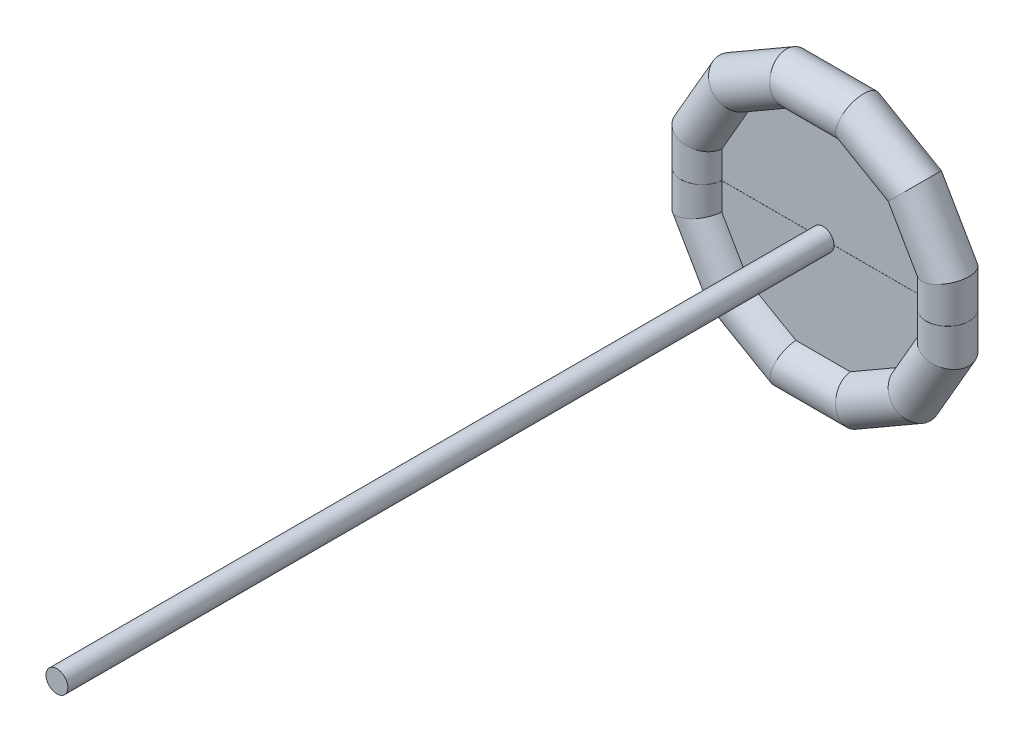
ISO-10303-21;
HEADER;
FILE_DESCRIPTION(('STEP AP214'),'2;1');
FILE_NAME('part.step','',(''),(''),'','','');
FILE_SCHEMA(('AUTOMOTIVE_DESIGN { 1 0 10303 214 1 1 1 1 }'));
ENDSEC;
DATA;
#1=APPLICATION_CONTEXT('core data for automotive mechanical design processes');
#2=APPLICATION_PROTOCOL_DEFINITION('international standard','automotive_design',2000,#1);
#3=PRODUCT_CONTEXT('',#1,'mechanical');
#4=PRODUCT('Part','Part','',(#3));
#5=PRODUCT_RELATED_PRODUCT_CATEGORY('part','',(#4));
#6=PRODUCT_DEFINITION_FORMATION('','',#4);
#7=PRODUCT_DEFINITION_CONTEXT('part definition',#1,'design');
#8=PRODUCT_DEFINITION('design','',#6,#7);
#9=PRODUCT_DEFINITION_SHAPE('','',#8);
#10=(LENGTH_UNIT() NAMED_UNIT(*) SI_UNIT(.MILLI.,.METRE.));
#11=(NAMED_UNIT(*) PLANE_ANGLE_UNIT() SI_UNIT($,.RADIAN.));
#12=(NAMED_UNIT(*) SI_UNIT($,.STERADIAN.) SOLID_ANGLE_UNIT());
#13=UNCERTAINTY_MEASURE_WITH_UNIT(LENGTH_MEASURE(1.E-05),#10,'distance_accuracy_value','');
#14=(GEOMETRIC_REPRESENTATION_CONTEXT(3) GLOBAL_UNCERTAINTY_ASSIGNED_CONTEXT((#13)) GLOBAL_UNIT_ASSIGNED_CONTEXT((#10,
#11,#12)) REPRESENTATION_CONTEXT('',''));
#15=CARTESIAN_POINT('',(0.,0.,0.));
#16=DIRECTION('',(0.,0.,1.));
#17=DIRECTION('',(1.,0.,0.));
#18=AXIS2_PLACEMENT_3D('',#15,#16,#17);
#19=CARTESIAN_POINT('',(0.,0.,-10079.1542714033));
#20=DIRECTION('',(0.,0.,1.));
#21=DIRECTION('',(1.,0.,0.));
#22=AXIS2_PLACEMENT_3D('',#19,#20,#21);
#23=PLANE('',#22);
#24=DIRECTION('',(1.,0.,0.));
#25=VECTOR('',#24,1.);
#26=CARTESIAN_POINT('',(5016.94381271313,-5.08455526785216,-10079.1542714033));
#27=LINE('',#26,#25);
#28=CARTESIAN_POINT('',(-533.375765570319,-5.08455526792967,-10079.1542714033));
#29=VERTEX_POINT('',#28);
#30=CARTESIAN_POINT('',(533.375765570319,-5.08455526830635,-10079.1542714033));
#31=VERTEX_POINT('',#30);
#32=EDGE_CURVE('E56',#29,#31,#27,.T.);
#33=ORIENTED_EDGE('',*,*,#32,.F.);
#34=CARTESIAN_POINT('',(0.,0.,-10079.1542714033));
#35=DIRECTION('',(0.,0.,1.));
#36=DIRECTION('',(1.,0.,0.));
#37=AXIS2_PLACEMENT_3D('',#34,#35,#36);
#38=CIRCLE('',#37,533.4);
#39=CARTESIAN_POINT('',(-533.4,-0.00455526792932917,-10079.1542714033));
#40=VERTEX_POINT('',#39);
#41=EDGE_CURVE('E248',#40,#29,#38,.T.);
#42=ORIENTED_EDGE('',*,*,#41,.F.);
#43=DIRECTION('',(1.,0.,0.));
#44=VECTOR('',#43,1.);
#45=CARTESIAN_POINT('',(5016.94381271313,-0.00455526785181348,-10079.1542714033));
#46=LINE('',#45,#44);
#47=CARTESIAN_POINT('',(533.399999980549,-0.00455526791460199,-10079.1542714033));
#48=VERTEX_POINT('',#47);
#49=EDGE_CURVE('E64',#40,#48,#46,.T.);
#50=ORIENTED_EDGE('',*,*,#49,.T.);
#51=EDGE_CURVE('E252',#31,#48,#38,.T.);
#52=ORIENTED_EDGE('',*,*,#51,.F.);
#53=EDGE_LOOP('',(#33,#42,#50,#52));
#54=FACE_BOUND('',#53,.T.);
#55=ADVANCED_FACE('F41',(#54),#23,.F.);
#56=CARTESIAN_POINT('',(5016.94381271306,5016.9577247322,-10079.1542714032));
#57=DIRECTION('',(0.,0.,-1.));
#58=DIRECTION('',(0.,-1.,0.));
#59=AXIS2_PLACEMENT_3D('',#56,#57,#58);
#60=PLANE('',#59);
#61=EDGE_CURVE('E177',#48,#40,#38,.T.);
#62=ORIENTED_EDGE('',*,*,#61,.F.);
#63=CARTESIAN_POINT('',(4945.52443736012,-0.00455526785270166,-10079.1542714033));
#64=VERTEX_POINT('',#63);
#65=EDGE_CURVE('E254',#48,#64,#46,.T.);
#66=ORIENTED_EDGE('',*,*,#65,.T.);
#67=DIRECTION('',(0.,1.,0.));
#68=VECTOR('',#67,1.);
#69=CARTESIAN_POINT('',(4945.52443736134,-70408.8045552679,-10079.154271404));
#70=LINE('',#69,#68);
#71=CARTESIAN_POINT('',(4945.52443736009,1325.14967216577,-10079.1542714033));
#72=VERTEX_POINT('',#71);
#73=EDGE_CURVE('E49',#72,#64,#70,.F.);
#74=ORIENTED_EDGE('',*,*,#73,.F.);
#75=DIRECTION('',(-0.500000000000016,0.866025403784429,0.));
#76=VECTOR('',#75,1.);
#77=CARTESIAN_POINT('',(39487.3473236444,-58503.0425529215,-10079.1542714041));
#78=LINE('',#77,#76);
#79=CARTESIAN_POINT('',(3620.37020992644,3620.38412194544,-10079.1542714032));
#80=VERTEX_POINT('',#79);
#81=EDGE_CURVE('E302',#80,#72,#78,.F.);
#82=ORIENTED_EDGE('',*,*,#81,.F.);
#83=DIRECTION('',(-0.866025403784449,0.499999999999983,0.));
#84=VECTOR('',#83,1.);
#85=CARTESIAN_POINT('',(63448.5624350151,-30921.4387643366,-10079.154271404));
#86=LINE('',#85,#84);
#87=CARTESIAN_POINT('',(1325.13576014672,4945.538349379,-10079.1542714032));
#88=VERTEX_POINT('',#87);
#89=EDGE_CURVE('E294',#88,#80,#86,.F.);
#90=ORIENTED_EDGE('',*,*,#89,.F.);
#91=DIRECTION('',(-1.,0.,0.));
#92=VECTOR('',#91,1.);
#93=CARTESIAN_POINT('',(70408.7815327131,4945.53834938045,-10079.1542714037));
#94=LINE('',#93,#92);
#95=CARTESIAN_POINT('',(-1325.1726947205,4945.53834937895,-10079.1542714032));
#96=VERTEX_POINT('',#95);
#97=EDGE_CURVE('E286',#96,#88,#94,.F.);
#98=ORIENTED_EDGE('',*,*,#97,.F.);
#99=DIRECTION('',(-0.866025403784428,-0.500000000000019,0.));
#100=VECTOR('',#99,1.);
#101=CARTESIAN_POINT('',(58503.0195303667,39487.3612356635,-10079.1542714033));
#102=LINE('',#101,#100);
#103=CARTESIAN_POINT('',(-3620.40714450016,3620.38412194529,-10079.1542714032));
#104=VERTEX_POINT('',#103);
#105=EDGE_CURVE('E278',#104,#96,#102,.F.);
#106=ORIENTED_EDGE('',*,*,#105,.F.);
#107=DIRECTION('',(-0.49999999999998,-0.86602540378445,0.));
#108=VECTOR('',#107,1.);
#109=CARTESIAN_POINT('',(30921.4157417817,63448.576347034,-10079.1542714028));
#110=LINE('',#109,#108);
#111=CARTESIAN_POINT('',(-4945.56137193372,1325.14967216556,-10079.1542714032));
#112=VERTEX_POINT('',#111);
#113=EDGE_CURVE('E270',#112,#104,#110,.F.);
#114=ORIENTED_EDGE('',*,*,#113,.F.);
#115=DIRECTION('',(0.,-1.,0.));
#116=VECTOR('',#115,1.);
#117=CARTESIAN_POINT('',(-4945.5613719354,70408.795444732,-10079.1542714025));
#118=LINE('',#117,#116);
#119=CARTESIAN_POINT('',(-4945.56137193368,-0.00455526799125749,-10079.1542714032));
#120=VERTEX_POINT('',#119);
#121=EDGE_CURVE('E262',#120,#112,#118,.F.);
#122=ORIENTED_EDGE('',*,*,#121,.F.);
#123=EDGE_CURVE('E255',#120,#40,#46,.T.);
#124=ORIENTED_EDGE('',*,*,#123,.T.);
#125=EDGE_LOOP('',(#62,#66,#74,#82,#90,#98,#106,#114,#122,#124));
#126=FACE_BOUND('',#125,.T.);
#127=ADVANCED_FACE('F43',(#126),#60,.F.);
#128=CARTESIAN_POINT('',(5016.94381271306,5016.9577247322,-10262.5105214032));
#129=DIRECTION('',(0.,0.,-1.));
#130=DIRECTION('',(0.,-1.,0.));
#131=AXIS2_PLACEMENT_3D('',#128,#129,#130);
#132=PLANE('',#131);
#133=DIRECTION('',(1.,0.,0.));
#134=VECTOR('',#133,1.);
#135=CARTESIAN_POINT('',(5016.94381271313,-0.00455526785003713,-10262.5105214033));
#136=LINE('',#135,#134);
#137=CARTESIAN_POINT('',(-4945.56137193368,-0.00455526798859296,-10262.5105214032));
#138=VERTEX_POINT('',#137);
#139=CARTESIAN_POINT('',(4945.52443736012,-0.0045552678509253,-10262.5105214033));
#140=VERTEX_POINT('',#139);
#141=EDGE_CURVE('E247',#138,#140,#136,.T.);
#142=ORIENTED_EDGE('',*,*,#141,.F.);
#143=DIRECTION('',(0.,-1.,0.));
#144=VECTOR('',#143,1.);
#145=CARTESIAN_POINT('',(-4945.5613719354,70408.795444732,-10262.5105214025));
#146=LINE('',#145,#144);
#147=CARTESIAN_POINT('',(-4945.56137193371,1325.14967216557,-10262.5105214032));
#148=VERTEX_POINT('',#147);
#149=EDGE_CURVE('E260',#138,#148,#146,.F.);
#150=ORIENTED_EDGE('',*,*,#149,.T.);
#151=DIRECTION('',(-0.49999999999998,-0.86602540378445,0.));
#152=VECTOR('',#151,1.);
#153=CARTESIAN_POINT('',(30921.4157417817,63448.576347034,-10262.5105214028));
#154=LINE('',#153,#152);
#155=CARTESIAN_POINT('',(-3620.40714450016,3620.38412194529,-10262.5105214032));
#156=VERTEX_POINT('',#155);
#157=EDGE_CURVE('E267',#148,#156,#154,.F.);
#158=ORIENTED_EDGE('',*,*,#157,.T.);
#159=DIRECTION('',(-0.866025403784428,-0.500000000000019,0.));
#160=VECTOR('',#159,1.);
#161=CARTESIAN_POINT('',(58503.0195303667,39487.3612356635,-10262.5105214033));
#162=LINE('',#161,#160);
#163=CARTESIAN_POINT('',(-1325.17269472049,4945.53834937895,-10262.5105214032));
#164=VERTEX_POINT('',#163);
#165=EDGE_CURVE('E275',#156,#164,#162,.F.);
#166=ORIENTED_EDGE('',*,*,#165,.T.);
#167=DIRECTION('',(-1.,0.,0.));
#168=VECTOR('',#167,1.);
#169=CARTESIAN_POINT('',(70408.7815327131,4945.53834938045,-10262.5105214037));
#170=LINE('',#169,#168);
#171=CARTESIAN_POINT('',(1325.13576014672,4945.538349379,-10262.5105214032));
#172=VERTEX_POINT('',#171);
#173=EDGE_CURVE('E283',#164,#172,#170,.F.);
#174=ORIENTED_EDGE('',*,*,#173,.T.);
#175=DIRECTION('',(-0.866025403784449,0.499999999999983,0.));
#176=VECTOR('',#175,1.);
#177=CARTESIAN_POINT('',(63448.5624350151,-30921.4387643366,-10262.510521404));
#178=LINE('',#177,#176);
#179=CARTESIAN_POINT('',(3620.37020992644,3620.38412194544,-10262.5105214032));
#180=VERTEX_POINT('',#179);
#181=EDGE_CURVE('E291',#172,#180,#178,.F.);
#182=ORIENTED_EDGE('',*,*,#181,.T.);
#183=DIRECTION('',(-0.500000000000016,0.866025403784429,0.));
#184=VECTOR('',#183,1.);
#185=CARTESIAN_POINT('',(39487.3473236444,-58503.0425529215,-10262.5105214042));
#186=LINE('',#185,#184);
#187=CARTESIAN_POINT('',(4945.52443736009,1325.14967216577,-10262.5105214033));
#188=VERTEX_POINT('',#187);
#189=EDGE_CURVE('E299',#180,#188,#186,.F.);
#190=ORIENTED_EDGE('',*,*,#189,.T.);
#191=DIRECTION('',(0.,1.,0.));
#192=VECTOR('',#191,1.);
#193=CARTESIAN_POINT('',(4945.52443736134,-70408.8045552679,-10262.510521404));
#194=LINE('',#193,#192);
#195=EDGE_CURVE('E307',#188,#140,#194,.F.);
#196=ORIENTED_EDGE('',*,*,#195,.T.);
#197=EDGE_LOOP('',(#142,#150,#158,#166,#174,#182,#190,#196));
#198=FACE_BOUND('',#197,.T.);
#199=ADVANCED_FACE('F323',(#198),#132,.T.);
#200=CARTESIAN_POINT('',(5989.25581271444,-70408.8045552678,-10170.832396404));
#201=DIRECTION('',(0.,1.,0.));
#202=DIRECTION('',(-1.,0.,0.));
#203=AXIS2_PLACEMENT_3D('',#200,#201,#202);
#204=CYLINDRICAL_SURFACE('',#203,1047.75);
#205=ORIENTED_EDGE('',*,*,#73,.T.);
#206=CARTESIAN_POINT('',(5989.25581271322,-0.00455526783760263,-10170.8323964033));
#207=DIRECTION('',(0.,1.,0.));
#208=DIRECTION('',(-1.,0.,0.));
#209=AXIS2_PLACEMENT_3D('',#206,#207,#208);
#210=CIRCLE('',#209,1047.75);
#211=EDGE_CURVE('E257',#64,#140,#210,.T.);
#212=ORIENTED_EDGE('',*,*,#211,.T.);
#213=ORIENTED_EDGE('',*,*,#195,.F.);
#214=CARTESIAN_POINT('',(5989.25581271319,1604.81665130669,-10170.8323964033));
#215=DIRECTION('',(-0.258819045102538,0.965925826289063,0.));
#216=DIRECTION('',(0.965925826289064,0.258819045102538,0.));
#217=AXIS2_PLACEMENT_3D('',#214,#215,#216);
#218=ELLIPSE('',#217,1084.71061802467,1047.75);
#219=EDGE_CURVE('E305',#72,#188,#218,.T.);
#220=ORIENTED_EDGE('',*,*,#219,.F.);
#221=EDGE_LOOP('',(#205,#212,#213,#220));
#222=FACE_BOUND('',#221,.T.);
#223=ADVANCED_FACE('F312',(#222),#204,.T.);
#224=CARTESIAN_POINT('',(40391.2452094271,-57981.176865245,-10170.8323964042));
#225=DIRECTION('',(-0.500000000000016,0.866025403784429,0.));
#226=DIRECTION('',(-0.866025403784429,-0.500000000000016,0.));
#227=AXIS2_PLACEMENT_3D('',#224,#225,#226);
#228=CYLINDRICAL_SURFACE('',#227,1047.75);
#229=CARTESIAN_POINT('',(4384.43460613864,4384.44851815768,-10170.8323964032));
#230=DIRECTION('',(-0.707106781186561,0.707106781186534,0.));
#231=DIRECTION('',(0.707106781186534,0.707106781186561,0.));
#232=AXIS2_PLACEMENT_3D('',#229,#230,#231);
#233=ELLIPSE('',#232,1084.71061802467,1047.75);
#234=EDGE_CURVE('E297',#80,#180,#233,.T.);
#235=ORIENTED_EDGE('',*,*,#234,.F.);
#236=ORIENTED_EDGE('',*,*,#81,.T.);
#237=ORIENTED_EDGE('',*,*,#219,.T.);
#238=ORIENTED_EDGE('',*,*,#189,.F.);
#239=EDGE_LOOP('',(#235,#236,#237,#238));
#240=FACE_BOUND('',#239,.T.);
#241=ADVANCED_FACE('F346',(#240),#228,.T.);
#242=CARTESIAN_POINT('',(63970.4281226916,-30017.5408785539,-10170.832396404));
#243=DIRECTION('',(-0.866025403784449,0.499999999999983,0.));
#244=DIRECTION('',(-0.499999999999983,-0.866025403784449,0.));
#245=AXIS2_PLACEMENT_3D('',#242,#243,#244);
#246=CYLINDRICAL_SURFACE('',#245,1047.75);
#247=CARTESIAN_POINT('',(1604.80273928758,5989.26972473212,-10170.8323964032));
#248=DIRECTION('',(-0.965925826289074,0.258819045102501,0.));
#249=DIRECTION('',(0.258819045102501,0.965925826289074,0.));
#250=AXIS2_PLACEMENT_3D('',#247,#248,#249);
#251=ELLIPSE('',#250,1084.71061802467,1047.75);
#252=EDGE_CURVE('E289',#88,#172,#251,.T.);
#253=ORIENTED_EDGE('',*,*,#252,.F.);
#254=ORIENTED_EDGE('',*,*,#89,.T.);
#255=ORIENTED_EDGE('',*,*,#234,.T.);
#256=ORIENTED_EDGE('',*,*,#181,.F.);
#257=EDGE_LOOP('',(#253,#254,#255,#256));
#258=FACE_BOUND('',#257,.T.);
#259=ADVANCED_FACE('F343',(#258),#246,.T.);
#260=CARTESIAN_POINT('',(70408.7815327131,5989.26972473356,-10170.8323964037));
#261=DIRECTION('',(-1.,0.,0.));
#262=DIRECTION('',(0.,-1.,0.));
#263=AXIS2_PLACEMENT_3D('',#260,#261,#262);
#264=CYLINDRICAL_SURFACE('',#263,1047.75);
#265=CARTESIAN_POINT('',(-1604.83967386141,5989.26972473205,-10170.8323964032));
#266=DIRECTION('',(-0.965925826289063,-0.258819045102542,0.));
#267=DIRECTION('',(-0.258819045102542,0.965925826289063,0.));
#268=AXIS2_PLACEMENT_3D('',#265,#266,#267);
#269=ELLIPSE('',#268,1084.71061802467,1047.75);
#270=EDGE_CURVE('E281',#96,#164,#269,.T.);
#271=ORIENTED_EDGE('',*,*,#270,.F.);
#272=ORIENTED_EDGE('',*,*,#97,.T.);
#273=ORIENTED_EDGE('',*,*,#252,.T.);
#274=ORIENTED_EDGE('',*,*,#173,.F.);
#275=EDGE_LOOP('',(#271,#272,#273,#274));
#276=FACE_BOUND('',#275,.T.);
#277=ADVANCED_FACE('F339',(#276),#264,.T.);
#278=CARTESIAN_POINT('',(57981.1538426901,40391.2591214461,-10170.8323964032));
#279=DIRECTION('',(-0.866025403784428,-0.500000000000019,0.));
#280=DIRECTION('',(0.500000000000019,-0.866025403784428,0.));
#281=AXIS2_PLACEMENT_3D('',#278,#279,#280);
#282=CYLINDRICAL_SURFACE('',#281,1047.75);
#283=CARTESIAN_POINT('',(-4384.4715407124,4384.44851815748,-10170.8323964032));
#284=DIRECTION('',(-0.707106781186531,-0.707106781186564,0.));
#285=DIRECTION('',(-0.707106781186564,0.707106781186531,0.));
#286=AXIS2_PLACEMENT_3D('',#283,#284,#285);
#287=ELLIPSE('',#286,1084.71061802467,1047.75);
#288=EDGE_CURVE('E273',#104,#156,#287,.T.);
#289=ORIENTED_EDGE('',*,*,#288,.F.);
#290=ORIENTED_EDGE('',*,*,#105,.T.);
#291=ORIENTED_EDGE('',*,*,#270,.T.);
#292=ORIENTED_EDGE('',*,*,#165,.F.);
#293=EDGE_LOOP('',(#289,#290,#291,#292));
#294=FACE_BOUND('',#293,.T.);
#295=ADVANCED_FACE('F336',(#294),#282,.T.);
#296=CARTESIAN_POINT('',(30017.517855999,63970.4420347106,-10170.8323964028));
#297=DIRECTION('',(-0.49999999999998,-0.86602540378445,0.));
#298=DIRECTION('',(0.86602540378445,-0.49999999999998,0.));
#299=AXIS2_PLACEMENT_3D('',#296,#297,#298);
#300=CYLINDRICAL_SURFACE('',#299,1047.75);
#301=CARTESIAN_POINT('',(-5989.29274728683,1604.81665130643,-10170.8323964032));
#302=DIRECTION('',(-0.258819045102497,-0.965925826289074,0.));
#303=DIRECTION('',(-0.965925826289075,0.258819045102498,0.));
#304=AXIS2_PLACEMENT_3D('',#301,#302,#303);
#305=ELLIPSE('',#304,1084.71061802467,1047.75);
#306=EDGE_CURVE('E264',#112,#148,#305,.T.);
#307=ORIENTED_EDGE('',*,*,#306,.F.);
#308=ORIENTED_EDGE('',*,*,#113,.T.);
#309=ORIENTED_EDGE('',*,*,#288,.T.);
#310=ORIENTED_EDGE('',*,*,#157,.F.);
#311=EDGE_LOOP('',(#307,#308,#309,#310));
#312=FACE_BOUND('',#311,.T.);
#313=ADVANCED_FACE('F331',(#312),#300,.T.);
#314=CARTESIAN_POINT('',(-5989.29274728851,70408.7954447319,-10170.8323964025));
#315=DIRECTION('',(0.,-1.,0.));
#316=DIRECTION('',(1.,0.,0.));
#317=AXIS2_PLACEMENT_3D('',#314,#315,#316);
#318=CYLINDRICAL_SURFACE('',#317,1047.75);
#319=ORIENTED_EDGE('',*,*,#149,.F.);
#320=CARTESIAN_POINT('',(-5989.29274728679,-0.00455526800458017,-10170.8323964032));
#321=DIRECTION('',(0.,1.,0.));
#322=DIRECTION('',(-1.,0.,0.));
#323=AXIS2_PLACEMENT_3D('',#320,#321,#322);
#324=CIRCLE('',#323,1047.75);
#325=EDGE_CURVE('E12',#138,#120,#324,.T.);
#326=ORIENTED_EDGE('',*,*,#325,.T.);
#327=ORIENTED_EDGE('',*,*,#121,.T.);
#328=ORIENTED_EDGE('',*,*,#306,.T.);
#329=EDGE_LOOP('',(#319,#326,#327,#328));
#330=FACE_BOUND('',#329,.T.);
#331=ADVANCED_FACE('F325',(#330),#318,.T.);
#332=CARTESIAN_POINT('',(-0.0184672867857275,-0.0045552679210914,-10170.8323964033));
#333=DIRECTION('',(0.,1.,0.));
#334=DIRECTION('',(-1.,0.,0.));
#335=AXIS2_PLACEMENT_3D('',#332,#333,#334);
#336=PLANE('',#335);
#337=ORIENTED_EDGE('',*,*,#211,.F.);
#338=ORIENTED_EDGE('',*,*,#65,.F.);
#339=ORIENTED_EDGE('',*,*,#49,.F.);
#340=ORIENTED_EDGE('',*,*,#123,.F.);
#341=ORIENTED_EDGE('',*,*,#325,.F.);
#342=ORIENTED_EDGE('',*,*,#141,.T.);
#343=EDGE_LOOP('',(#337,#338,#339,#340,#341,#342));
#344=FACE_BOUND('',#343,.T.);
#345=ADVANCED_FACE('F319',(#344),#336,.F.);
#346=CARTESIAN_POINT('',(0.,0.,27320.8457285967));
#347=DIRECTION('',(0.,0.,-1.));
#348=DIRECTION('',(-1.,0.,0.));
#349=AXIS2_PLACEMENT_3D('',#346,#347,#348);
#350=CYLINDRICAL_SURFACE('',#349,533.4);
#351=CARTESIAN_POINT('',(0.,0.,27320.8457285967));
#352=DIRECTION('',(0.,0.,1.));
#353=DIRECTION('',(1.,0.,0.));
#354=AXIS2_PLACEMENT_3D('',#351,#352,#353);
#355=CIRCLE('',#354,533.4);
#356=CARTESIAN_POINT('',(533.4,0.,27320.8457285967));
#357=VERTEX_POINT('',#356);
#358=EDGE_CURVE('E244',#357,#357,#355,.T.);
#359=ORIENTED_EDGE('',*,*,#358,.F.);
#360=EDGE_LOOP('',(#359));
#361=FACE_BOUND('',#360,.T.);
#362=ORIENTED_EDGE('',*,*,#41,.T.);
#363=EDGE_CURVE('E251',#29,#31,#38,.T.);
#364=ORIENTED_EDGE('',*,*,#363,.T.);
#365=ORIENTED_EDGE('',*,*,#51,.T.);
#366=ORIENTED_EDGE('',*,*,#61,.T.);
#367=EDGE_LOOP('',(#362,#364,#365,#366));
#368=FACE_BOUND('',#367,.T.);
#369=ADVANCED_FACE('F349',(#361,#368),#350,.T.);
#370=CARTESIAN_POINT('',(0.,0.,27320.8457285967));
#371=DIRECTION('',(0.,0.,1.));
#372=DIRECTION('',(1.,0.,0.));
#373=AXIS2_PLACEMENT_3D('',#370,#371,#372);
#374=PLANE('',#373);
#375=ORIENTED_EDGE('',*,*,#358,.T.);
#376=EDGE_LOOP('',(#375));
#377=FACE_BOUND('',#376,.T.);
#378=ADVANCED_FACE('F391',(#377),#374,.T.);
#379=CARTESIAN_POINT('',(5016.9438127132,-5022.0468352679,-10079.1542714033));
#380=DIRECTION('',(0.,0.,-1.));
#381=DIRECTION('',(0.,1.,0.));
#382=AXIS2_PLACEMENT_3D('',#379,#380,#381);
#383=PLANE('',#382);
#384=CARTESIAN_POINT('',(4945.52443736012,-5.08455526785326,-10079.1542714033));
#385=VERTEX_POINT('',#384);
#386=EDGE_CURVE('E193',#31,#385,#27,.T.);
#387=ORIENTED_EDGE('',*,*,#386,.F.);
#388=ORIENTED_EDGE('',*,*,#363,.F.);
#389=CARTESIAN_POINT('',(-4945.56137193368,-5.08455526799098,-10079.1542714032));
#390=VERTEX_POINT('',#389);
#391=EDGE_CURVE('E196',#390,#29,#27,.T.);
#392=ORIENTED_EDGE('',*,*,#391,.F.);
#393=DIRECTION('',(0.,1.,0.));
#394=VECTOR('',#393,1.);
#395=CARTESIAN_POINT('',(-4945.56137193343,-70413.884555268,-10079.154271404));
#396=LINE('',#395,#394);
#397=CARTESIAN_POINT('',(-4945.56137193368,-1330.23878270155,-10079.1542714032));
#398=VERTEX_POINT('',#397);
#399=EDGE_CURVE('E174',#390,#398,#396,.F.);
#400=ORIENTED_EDGE('',*,*,#399,.T.);
#401=DIRECTION('',(-0.500000000000004,0.866025403784436,0.));
#402=VECTOR('',#401,1.);
#403=CARTESIAN_POINT('',(30921.4157417834,-63453.665457569,-10079.1542714041));
#404=LINE('',#403,#402);
#405=CARTESIAN_POINT('',(-3620.40714450006,-3625.47323248123,-10079.1542714033));
#406=VERTEX_POINT('',#405);
#407=EDGE_CURVE('E203',#398,#406,#404,.F.);
#408=ORIENTED_EDGE('',*,*,#407,.T.);
#409=DIRECTION('',(-0.866025403784442,0.499999999999995,0.));
#410=VECTOR('',#409,1.);
#411=CARTESIAN_POINT('',(58503.0195303678,-39492.4503461977,-10079.1542714041));
#412=LINE('',#411,#410);
#413=CARTESIAN_POINT('',(-1325.17269472036,-4950.62745991483,-10079.1542714033));
#414=VERTEX_POINT('',#413);
#415=EDGE_CURVE('E211',#406,#414,#412,.F.);
#416=ORIENTED_EDGE('',*,*,#415,.T.);
#417=DIRECTION('',(-1.,0.,0.));
#418=VECTOR('',#417,1.);
#419=CARTESIAN_POINT('',(70408.7815327133,-4950.62745991433,-10079.1542714038));
#420=LINE('',#419,#418);
#421=CARTESIAN_POINT('',(1325.13576014686,-4950.62745991481,-10079.1542714033));
#422=VERTEX_POINT('',#421);
#423=EDGE_CURVE('E219',#414,#422,#420,.F.);
#424=ORIENTED_EDGE('',*,*,#423,.T.);
#425=DIRECTION('',(-0.866025403784435,-0.500000000000007,0.));
#426=VECTOR('',#425,1.);
#427=CARTESIAN_POINT('',(63448.5624350142,30916.3496538025,-10079.1542714034));
#428=LINE('',#427,#426);
#429=CARTESIAN_POINT('',(3620.37020992654,-3625.47323248119,-10079.1542714033));
#430=VERTEX_POINT('',#429);
#431=EDGE_CURVE('E227',#422,#430,#428,.F.);
#432=ORIENTED_EDGE('',*,*,#431,.T.);
#433=DIRECTION('',(-0.499999999999992,-0.866025403784443,0.));
#434=VECTOR('',#433,1.);
#435=CARTESIAN_POINT('',(39487.3473236428,58497.9534423868,-10079.1542714029));
#436=LINE('',#435,#434);
#437=CARTESIAN_POINT('',(4945.52443736013,-1330.23878270148,-10079.1542714033));
#438=VERTEX_POINT('',#437);
#439=EDGE_CURVE('E235',#430,#438,#436,.F.);
#440=ORIENTED_EDGE('',*,*,#439,.T.);
#441=DIRECTION('',(0.,-1.,0.));
#442=VECTOR('',#441,1.);
#443=CARTESIAN_POINT('',(4945.52443735937,70403.7154447322,-10079.1542714026));
#444=LINE('',#443,#442);
#445=EDGE_CURVE('E178',#438,#385,#444,.F.);
#446=ORIENTED_EDGE('',*,*,#445,.T.);
#447=EDGE_LOOP('',(#387,#388,#392,#400,#408,#416,#424,#432,#440,#446));
#448=FACE_BOUND('',#447,.T.);
#449=ADVANCED_FACE('F354',(#448),#383,.F.);
#450=CARTESIAN_POINT('',(5016.9438127132,-5022.0468352679,-10262.5105214034));
#451=DIRECTION('',(0.,0.,-1.));
#452=DIRECTION('',(0.,1.,0.));
#453=AXIS2_PLACEMENT_3D('',#450,#451,#452);
#454=PLANE('',#453);
#455=DIRECTION('',(1.,0.,0.));
#456=VECTOR('',#455,1.);
#457=CARTESIAN_POINT('',(5016.94381271313,-5.08455526785009,-10262.5105214033));
#458=LINE('',#457,#456);
#459=CARTESIAN_POINT('',(-4945.56137193368,-5.08455526798981,-10262.5105214032));
#460=VERTEX_POINT('',#459);
#461=CARTESIAN_POINT('',(4945.52443736012,-5.0845552678512,-10262.5105214033));
#462=VERTEX_POINT('',#461);
#463=EDGE_CURVE('E184',#460,#462,#458,.T.);
#464=ORIENTED_EDGE('',*,*,#463,.T.);
#465=DIRECTION('',(0.,-1.,0.));
#466=VECTOR('',#465,1.);
#467=CARTESIAN_POINT('',(4945.52443735937,70403.7154447322,-10262.5105214026));
#468=LINE('',#467,#466);
#469=CARTESIAN_POINT('',(4945.52443736012,-1330.23878270147,-10262.5105214033));
#470=VERTEX_POINT('',#469);
#471=EDGE_CURVE('E240',#470,#462,#468,.F.);
#472=ORIENTED_EDGE('',*,*,#471,.F.);
#473=DIRECTION('',(-0.499999999999992,-0.866025403784443,0.));
#474=VECTOR('',#473,1.);
#475=CARTESIAN_POINT('',(39487.3473236428,58497.9534423868,-10262.5105214029));
#476=LINE('',#475,#474);
#477=CARTESIAN_POINT('',(3620.37020992654,-3625.47323248118,-10262.5105214033));
#478=VERTEX_POINT('',#477);
#479=EDGE_CURVE('E232',#478,#470,#476,.F.);
#480=ORIENTED_EDGE('',*,*,#479,.F.);
#481=DIRECTION('',(-0.866025403784435,-0.500000000000007,0.));
#482=VECTOR('',#481,1.);
#483=CARTESIAN_POINT('',(63448.5624350142,30916.3496538025,-10262.5105214034));
#484=LINE('',#483,#482);
#485=CARTESIAN_POINT('',(1325.13576014686,-4950.62745991481,-10262.5105214033));
#486=VERTEX_POINT('',#485);
#487=EDGE_CURVE('E224',#486,#478,#484,.F.);
#488=ORIENTED_EDGE('',*,*,#487,.F.);
#489=DIRECTION('',(-1.,0.,0.));
#490=VECTOR('',#489,1.);
#491=CARTESIAN_POINT('',(70408.7815327133,-4950.62745991432,-10262.5105214038));
#492=LINE('',#491,#490);
#493=CARTESIAN_POINT('',(-1325.17269472036,-4950.62745991483,-10262.5105214033));
#494=VERTEX_POINT('',#493);
#495=EDGE_CURVE('E216',#494,#486,#492,.F.);
#496=ORIENTED_EDGE('',*,*,#495,.F.);
#497=DIRECTION('',(-0.866025403784442,0.499999999999995,0.));
#498=VECTOR('',#497,1.);
#499=CARTESIAN_POINT('',(58503.0195303678,-39492.4503461977,-10262.5105214041));
#500=LINE('',#499,#498);
#501=CARTESIAN_POINT('',(-3620.40714450006,-3625.47323248123,-10262.5105214033));
#502=VERTEX_POINT('',#501);
#503=EDGE_CURVE('E208',#502,#494,#500,.F.);
#504=ORIENTED_EDGE('',*,*,#503,.F.);
#505=DIRECTION('',(-0.500000000000004,0.866025403784436,0.));
#506=VECTOR('',#505,1.);
#507=CARTESIAN_POINT('',(30921.4157417834,-63453.665457569,-10262.5105214041));
#508=LINE('',#507,#506);
#509=CARTESIAN_POINT('',(-4945.56137193368,-1330.23878270155,-10262.5105214032));
#510=VERTEX_POINT('',#509);
#511=EDGE_CURVE('E187',#510,#502,#508,.F.);
#512=ORIENTED_EDGE('',*,*,#511,.F.);
#513=DIRECTION('',(0.,1.,0.));
#514=VECTOR('',#513,1.);
#515=CARTESIAN_POINT('',(-4945.56137193344,-70413.884555268,-10262.510521404));
#516=LINE('',#515,#514);
#517=EDGE_CURVE('E171',#460,#510,#516,.F.);
#518=ORIENTED_EDGE('',*,*,#517,.F.);
#519=EDGE_LOOP('',(#464,#472,#480,#488,#496,#504,#512,#518));
#520=FACE_BOUND('',#519,.T.);
#521=ADVANCED_FACE('F182',(#520),#454,.T.);
#522=CARTESIAN_POINT('',(5989.25581271248,70403.7154447322,-10170.8323964026));
#523=DIRECTION('',(0.,-1.,0.));
#524=DIRECTION('',(-1.,0.,0.));
#525=AXIS2_PLACEMENT_3D('',#522,#523,#524);
#526=CYLINDRICAL_SURFACE('',#525,1047.75);
#527=ORIENTED_EDGE('',*,*,#445,.F.);
#528=CARTESIAN_POINT('',(5989.25581271323,-1609.90576184236,-10170.8323964033));
#529=DIRECTION('',(0.258819045102511,0.965925826289071,0.));
#530=DIRECTION('',(0.965925826289071,-0.258819045102511,0.));
#531=AXIS2_PLACEMENT_3D('',#528,#529,#530);
#532=ELLIPSE('',#531,1084.71061802467,1047.75);
#533=EDGE_CURVE('E238',#438,#470,#532,.T.);
#534=ORIENTED_EDGE('',*,*,#533,.T.);
#535=ORIENTED_EDGE('',*,*,#471,.T.);
#536=CARTESIAN_POINT('',(5989.25581271322,-5.08455526783729,-10170.8323964033));
#537=DIRECTION('',(0.,1.,0.));
#538=DIRECTION('',(-1.,0.,0.));
#539=AXIS2_PLACEMENT_3D('',#536,#537,#538);
#540=CIRCLE('',#539,1047.75);
#541=EDGE_CURVE('E188',#385,#462,#540,.T.);
#542=ORIENTED_EDGE('',*,*,#541,.F.);
#543=EDGE_LOOP('',(#527,#534,#535,#542));
#544=FACE_BOUND('',#543,.T.);
#545=ADVANCED_FACE('F357',(#544),#526,.T.);
#546=CARTESIAN_POINT('',(40391.2452094254,57976.0877547103,-10170.8323964029));
#547=DIRECTION('',(-0.499999999999992,-0.866025403784443,0.));
#548=DIRECTION('',(-0.866025403784443,0.499999999999992,0.));
#549=AXIS2_PLACEMENT_3D('',#546,#547,#548);
#550=CYLINDRICAL_SURFACE('',#549,1047.75);
#551=CARTESIAN_POINT('',(4384.43460613876,-4389.5376286934,-10170.8323964033));
#552=DIRECTION('',(0.707106781186542,0.707106781186554,0.));
#553=DIRECTION('',(0.707106781186554,-0.707106781186542,0.));
#554=AXIS2_PLACEMENT_3D('',#551,#552,#553);
#555=ELLIPSE('',#554,1084.71061802467,1047.75);
#556=EDGE_CURVE('E230',#430,#478,#555,.T.);
#557=ORIENTED_EDGE('',*,*,#556,.T.);
#558=ORIENTED_EDGE('',*,*,#479,.T.);
#559=ORIENTED_EDGE('',*,*,#533,.F.);
#560=ORIENTED_EDGE('',*,*,#439,.F.);
#561=EDGE_LOOP('',(#557,#558,#559,#560));
#562=FACE_BOUND('',#561,.T.);
#563=ADVANCED_FACE('F362',(#562),#550,.T.);
#564=CARTESIAN_POINT('',(63970.4281226908,30012.4517680198,-10170.8323964034));
#565=DIRECTION('',(-0.866025403784435,-0.500000000000007,0.));
#566=DIRECTION('',(-0.500000000000007,0.866025403784435,0.));
#567=AXIS2_PLACEMENT_3D('',#564,#565,#566);
#568=CYLINDRICAL_SURFACE('',#567,1047.75);
#569=CARTESIAN_POINT('',(1604.80273928775,-5994.35883526791,-10170.8323964033));
#570=DIRECTION('',(0.965925826289066,0.258819045102528,0.));
#571=DIRECTION('',(0.258819045102528,-0.965925826289067,0.));
#572=AXIS2_PLACEMENT_3D('',#569,#570,#571);
#573=ELLIPSE('',#572,1084.71061802467,1047.75);
#574=EDGE_CURVE('E222',#422,#486,#573,.T.);
#575=ORIENTED_EDGE('',*,*,#574,.T.);
#576=ORIENTED_EDGE('',*,*,#487,.T.);
#577=ORIENTED_EDGE('',*,*,#556,.F.);
#578=ORIENTED_EDGE('',*,*,#431,.F.);
#579=EDGE_LOOP('',(#575,#576,#577,#578));
#580=FACE_BOUND('',#579,.T.);
#581=ADVANCED_FACE('F366',(#580),#568,.T.);
#582=CARTESIAN_POINT('',(70408.7815327133,-5994.35883526743,-10170.8323964038));
#583=DIRECTION('',(-1.,0.,0.));
#584=DIRECTION('',(0.,1.,0.));
#585=AXIS2_PLACEMENT_3D('',#582,#583,#584);
#586=CYLINDRICAL_SURFACE('',#585,1047.75);
#587=CARTESIAN_POINT('',(-1604.83967386125,-5994.35883526793,-10170.8323964033));
#588=DIRECTION('',(0.96592582628907,-0.258819045102515,0.));
#589=DIRECTION('',(-0.258819045102515,-0.96592582628907,0.));
#590=AXIS2_PLACEMENT_3D('',#587,#588,#589);
#591=ELLIPSE('',#590,1084.71061802467,1047.75);
#592=EDGE_CURVE('E214',#414,#494,#591,.T.);
#593=ORIENTED_EDGE('',*,*,#592,.T.);
#594=ORIENTED_EDGE('',*,*,#495,.T.);
#595=ORIENTED_EDGE('',*,*,#574,.F.);
#596=ORIENTED_EDGE('',*,*,#423,.F.);
#597=EDGE_LOOP('',(#593,#594,#595,#596));
#598=FACE_BOUND('',#597,.T.);
#599=ADVANCED_FACE('F369',(#598),#586,.T.);
#600=CARTESIAN_POINT('',(57981.1538426913,-40396.3482319803,-10170.8323964041));
#601=DIRECTION('',(-0.866025403784442,0.499999999999995,0.));
#602=DIRECTION('',(0.499999999999995,0.866025403784442,0.));
#603=AXIS2_PLACEMENT_3D('',#600,#601,#602);
#604=CYLINDRICAL_SURFACE('',#603,1047.75);
#605=CARTESIAN_POINT('',(-4384.47154071227,-4389.53762869345,-10170.8323964033));
#606=DIRECTION('',(0.707106781186551,-0.707106781186544,0.));
#607=DIRECTION('',(-0.707106781186544,-0.707106781186551,0.));
#608=AXIS2_PLACEMENT_3D('',#605,#606,#607);
#609=ELLIPSE('',#608,1084.71061802467,1047.75);
#610=EDGE_CURVE('E206',#406,#502,#609,.T.);
#611=ORIENTED_EDGE('',*,*,#610,.T.);
#612=ORIENTED_EDGE('',*,*,#503,.T.);
#613=ORIENTED_EDGE('',*,*,#592,.F.);
#614=ORIENTED_EDGE('',*,*,#415,.F.);
#615=EDGE_LOOP('',(#611,#612,#613,#614));
#616=FACE_BOUND('',#615,.T.);
#617=ADVANCED_FACE('F371',(#616),#604,.T.);
#618=CARTESIAN_POINT('',(30017.5178560008,-63975.5311452456,-10170.8323964041));
#619=DIRECTION('',(-0.500000000000004,0.866025403784436,0.));
#620=DIRECTION('',(0.866025403784436,0.500000000000004,0.));
#621=AXIS2_PLACEMENT_3D('',#618,#619,#620);
#622=CYLINDRICAL_SURFACE('',#621,1047.75);
#623=CARTESIAN_POINT('',(-5989.29274728678,-1609.90576184244,-10170.8323964032));
#624=DIRECTION('',(0.258819045102524,-0.965925826289067,0.));
#625=DIRECTION('',(-0.965925826289067,-0.258819045102525,0.));
#626=AXIS2_PLACEMENT_3D('',#623,#624,#625);
#627=ELLIPSE('',#626,1084.71061802467,1047.75);
#628=EDGE_CURVE('E200',#398,#510,#627,.T.);
#629=ORIENTED_EDGE('',*,*,#628,.T.);
#630=ORIENTED_EDGE('',*,*,#511,.T.);
#631=ORIENTED_EDGE('',*,*,#610,.F.);
#632=ORIENTED_EDGE('',*,*,#407,.F.);
#633=EDGE_LOOP('',(#629,#630,#631,#632));
#634=FACE_BOUND('',#633,.T.);
#635=ADVANCED_FACE('F375',(#634),#622,.T.);
#636=CARTESIAN_POINT('',(-5989.29274728654,-70413.884555268,-10170.832396404));
#637=DIRECTION('',(0.,1.,0.));
#638=DIRECTION('',(1.,0.,0.));
#639=AXIS2_PLACEMENT_3D('',#636,#637,#638);
#640=CYLINDRICAL_SURFACE('',#639,1047.75);
#641=ORIENTED_EDGE('',*,*,#517,.T.);
#642=ORIENTED_EDGE('',*,*,#628,.F.);
#643=ORIENTED_EDGE('',*,*,#399,.F.);
#644=CARTESIAN_POINT('',(-5989.29274728679,-5.08455526800489,-10170.8323964032));
#645=DIRECTION('',(0.,1.,0.));
#646=DIRECTION('',(-1.,0.,0.));
#647=AXIS2_PLACEMENT_3D('',#644,#645,#646);
#648=CIRCLE('',#647,1047.75);
#649=EDGE_CURVE('E168',#460,#390,#648,.T.);
#650=ORIENTED_EDGE('',*,*,#649,.F.);
#651=EDGE_LOOP('',(#641,#642,#643,#650));
#652=FACE_BOUND('',#651,.T.);
#653=ADVANCED_FACE('F170',(#652),#640,.T.);
#654=CARTESIAN_POINT('',(-0.0184672867856565,-5.08455526792109,-10170.8323964033));
#655=DIRECTION('',(0.,-1.,0.));
#656=DIRECTION('',(-1.,0.,0.));
#657=AXIS2_PLACEMENT_3D('',#654,#655,#656);
#658=PLANE('',#657);
#659=ORIENTED_EDGE('',*,*,#541,.T.);
#660=ORIENTED_EDGE('',*,*,#463,.F.);
#661=ORIENTED_EDGE('',*,*,#649,.T.);
#662=ORIENTED_EDGE('',*,*,#391,.T.);
#663=ORIENTED_EDGE('',*,*,#32,.T.);
#664=ORIENTED_EDGE('',*,*,#386,.T.);
#665=EDGE_LOOP('',(#659,#660,#661,#662,#663,#664));
#666=FACE_BOUND('',#665,.T.);
#667=ADVANCED_FACE('F190',(#666),#658,.F.);
#668=CLOSED_SHELL('',(#55,#127,#199,#223,#241,#259,#277,#295,#313,#331,#345,#369,#378,#449,#521,
#545,#563,#581,#599,#617,#635,#653,#667));
#669=MANIFOLD_SOLID_BREP('B2',#668);
#670=ADVANCED_BREP_SHAPE_REPRESENTATION('',(#18,#669),#14);
#671=SHAPE_DEFINITION_REPRESENTATION(#9,#670);
ENDSEC;
END-ISO-10303-21;
